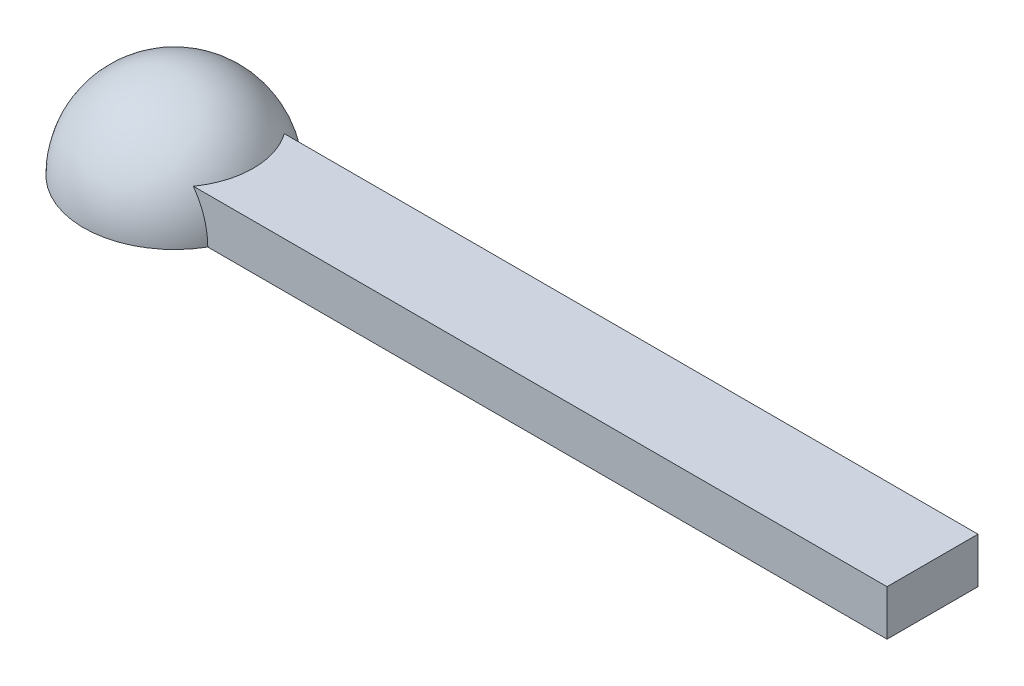
ISO-10303-21;
HEADER;
FILE_DESCRIPTION(('STEP AP214'),'2;1');
FILE_NAME('part.step','',(''),(''),'','','');
FILE_SCHEMA(('AUTOMOTIVE_DESIGN { 1 0 10303 214 1 1 1 1 }'));
ENDSEC;
DATA;
#1=APPLICATION_CONTEXT('core data for automotive mechanical design processes');
#2=APPLICATION_PROTOCOL_DEFINITION('international standard','automotive_design',2000,#1);
#3=PRODUCT_CONTEXT('',#1,'mechanical');
#4=PRODUCT('Part','Part','',(#3));
#5=PRODUCT_RELATED_PRODUCT_CATEGORY('part','',(#4));
#6=PRODUCT_DEFINITION_FORMATION('','',#4);
#7=PRODUCT_DEFINITION_CONTEXT('part definition',#1,'design');
#8=PRODUCT_DEFINITION('design','',#6,#7);
#9=PRODUCT_DEFINITION_SHAPE('','',#8);
#10=(LENGTH_UNIT() NAMED_UNIT(*) SI_UNIT(.MILLI.,.METRE.));
#11=(NAMED_UNIT(*) PLANE_ANGLE_UNIT() SI_UNIT($,.RADIAN.));
#12=(NAMED_UNIT(*) SI_UNIT($,.STERADIAN.) SOLID_ANGLE_UNIT());
#13=UNCERTAINTY_MEASURE_WITH_UNIT(LENGTH_MEASURE(1.E-05),#10,'distance_accuracy_value','');
#14=(GEOMETRIC_REPRESENTATION_CONTEXT(3) GLOBAL_UNCERTAINTY_ASSIGNED_CONTEXT((#13)) GLOBAL_UNIT_ASSIGNED_CONTEXT((#10,
#11,#12)) REPRESENTATION_CONTEXT('',''));
#15=CARTESIAN_POINT('',(0.,0.,0.));
#16=DIRECTION('',(0.,0.,1.));
#17=DIRECTION('',(1.,0.,0.));
#18=AXIS2_PLACEMENT_3D('',#15,#16,#17);
#19=CARTESIAN_POINT('',(0.,0.,0.));
#20=DIRECTION('',(-1.,0.,0.));
#21=DIRECTION('',(0.,0.,1.));
#22=AXIS2_PLACEMENT_3D('',#19,#20,#21);
#23=SPHERICAL_SURFACE('',#22,6.);
#24=CARTESIAN_POINT('',(0.,0.,3.));
#25=DIRECTION('',(0.,0.,1.));
#26=DIRECTION('',(1.,0.,0.));
#27=AXIS2_PLACEMENT_3D('',#24,#25,#26);
#28=CIRCLE('',#27,5.19615242270663);
#29=CARTESIAN_POINT('',(4.24264068711929,3.,3.));
#30=VERTEX_POINT('',#29);
#31=CARTESIAN_POINT('',(5.19615242270663,0.,3.));
#32=VERTEX_POINT('',#31);
#33=EDGE_CURVE('E55',#30,#32,#28,.F.);
#34=ORIENTED_EDGE('',*,*,#33,.F.);
#35=CARTESIAN_POINT('',(0.,3.,0.));
#36=DIRECTION('',(0.,1.,0.));
#37=DIRECTION('',(0.,0.,1.));
#38=AXIS2_PLACEMENT_3D('',#35,#36,#37);
#39=CIRCLE('',#38,5.19615242270663);
#40=CARTESIAN_POINT('',(4.24264068711929,3.,-3.));
#41=VERTEX_POINT('',#40);
#42=EDGE_CURVE('E87',#41,#30,#39,.F.);
#43=ORIENTED_EDGE('',*,*,#42,.F.);
#44=CARTESIAN_POINT('',(0.,0.,-3.));
#45=DIRECTION('',(0.,0.,-1.));
#46=DIRECTION('',(0.,1.,0.));
#47=AXIS2_PLACEMENT_3D('',#44,#45,#46);
#48=CIRCLE('',#47,5.19615242270663);
#49=CARTESIAN_POINT('',(5.19615242270663,0.,-3.));
#50=VERTEX_POINT('',#49);
#51=EDGE_CURVE('E95',#50,#41,#48,.F.);
#52=ORIENTED_EDGE('',*,*,#51,.F.);
#53=CARTESIAN_POINT('',(0.,0.,0.));
#54=DIRECTION('',(0.,-1.,0.));
#55=DIRECTION('',(0.,0.,-1.));
#56=AXIS2_PLACEMENT_3D('',#53,#54,#55);
#57=CIRCLE('',#56,6.);
#58=EDGE_CURVE('E48',#32,#50,#57,.T.);
#59=ORIENTED_EDGE('',*,*,#58,.F.);
#60=EDGE_LOOP('',(#34,#43,#52,#59));
#61=FACE_BOUND('',#60,.T.);
#62=ADVANCED_FACE('F39',(#61),#23,.T.);
#63=CARTESIAN_POINT('',(0.,0.,0.));
#64=DIRECTION('',(-1.,0.,0.));
#65=DIRECTION('',(0.,0.,-1.));
#66=AXIS2_PLACEMENT_3D('',#63,#64,#65);
#67=SPHERICAL_SURFACE('',#66,5.);
#68=CARTESIAN_POINT('',(0.,0.,0.));
#69=DIRECTION('',(0.,1.,0.));
#70=DIRECTION('',(0.,0.,-1.));
#71=AXIS2_PLACEMENT_3D('',#68,#69,#70);
#72=SPHERICAL_SURFACE('',#71,5.);
#73=CARTESIAN_POINT('',(0.,0.,0.));
#74=DIRECTION('',(0.,1.,0.));
#75=DIRECTION('',(0.,0.,-1.));
#76=AXIS2_PLACEMENT_3D('',#73,#74,#75);
#77=CIRCLE('',#76,5.);
#78=CARTESIAN_POINT('',(0.,0.,-5.));
#79=VERTEX_POINT('',#78);
#80=EDGE_CURVE('E11',#79,#79,#77,.T.);
#81=ORIENTED_EDGE('',*,*,#80,.F.);
#82=EDGE_LOOP('',(#81));
#83=FACE_BOUND('',#82,.T.);
#84=ADVANCED_FACE('F41',(#83),#72,.F.);
#85=CARTESIAN_POINT('',(0.,0.,0.));
#86=DIRECTION('',(0.,-1.,0.));
#87=DIRECTION('',(0.,0.,-1.));
#88=AXIS2_PLACEMENT_3D('',#85,#86,#87);
#89=PLANE('',#88);
#90=ORIENTED_EDGE('',*,*,#80,.T.);
#91=EDGE_LOOP('',(#90));
#92=FACE_BOUND('',#91,.T.);
#93=ORIENTED_EDGE('',*,*,#58,.T.);
#94=DIRECTION('',(-1.,0.,0.));
#95=VECTOR('',#94,1.);
#96=CARTESIAN_POINT('',(50.,0.,-3.));
#97=LINE('',#96,#95);
#98=CARTESIAN_POINT('',(50.,0.,-3.));
#99=VERTEX_POINT('',#98);
#100=EDGE_CURVE('E91',#99,#50,#97,.T.);
#101=ORIENTED_EDGE('',*,*,#100,.F.);
#102=DIRECTION('',(0.,0.,-1.));
#103=VECTOR('',#102,1.);
#104=CARTESIAN_POINT('',(50.,0.,3.));
#105=LINE('',#104,#103);
#106=CARTESIAN_POINT('',(50.,0.,3.));
#107=VERTEX_POINT('',#106);
#108=EDGE_CURVE('E111',#107,#99,#105,.T.);
#109=ORIENTED_EDGE('',*,*,#108,.F.);
#110=DIRECTION('',(-1.,0.,0.));
#111=VECTOR('',#110,1.);
#112=CARTESIAN_POINT('',(50.,0.,3.));
#113=LINE('',#112,#111);
#114=EDGE_CURVE('E123',#107,#32,#113,.T.);
#115=ORIENTED_EDGE('',*,*,#114,.T.);
#116=EDGE_LOOP('',(#93,#101,#109,#115));
#117=FACE_BOUND('',#116,.T.);
#118=ADVANCED_FACE('F127',(#92,#117),#89,.T.);
#119=CARTESIAN_POINT('',(50.,3.,3.));
#120=DIRECTION('',(0.,0.,-1.));
#121=DIRECTION('',(-1.,0.,0.));
#122=AXIS2_PLACEMENT_3D('',#119,#120,#121);
#123=PLANE('',#122);
#124=DIRECTION('',(-1.,0.,0.));
#125=VECTOR('',#124,1.);
#126=CARTESIAN_POINT('',(50.,3.,3.));
#127=LINE('',#126,#125);
#128=CARTESIAN_POINT('',(50.,3.,3.));
#129=VERTEX_POINT('',#128);
#130=EDGE_CURVE('E92',#129,#30,#127,.T.);
#131=ORIENTED_EDGE('',*,*,#130,.T.);
#132=ORIENTED_EDGE('',*,*,#33,.T.);
#133=ORIENTED_EDGE('',*,*,#114,.F.);
#134=DIRECTION('',(0.,-1.,0.));
#135=VECTOR('',#134,1.);
#136=CARTESIAN_POINT('',(50.,3.,3.));
#137=LINE('',#136,#135);
#138=EDGE_CURVE('E106',#129,#107,#137,.T.);
#139=ORIENTED_EDGE('',*,*,#138,.F.);
#140=EDGE_LOOP('',(#131,#132,#133,#139));
#141=FACE_BOUND('',#140,.T.);
#142=ADVANCED_FACE('F129',(#141),#123,.F.);
#143=CARTESIAN_POINT('',(50.,3.,-3.));
#144=DIRECTION('',(0.,0.,1.));
#145=DIRECTION('',(0.,-1.,0.));
#146=AXIS2_PLACEMENT_3D('',#143,#144,#145);
#147=PLANE('',#146);
#148=ORIENTED_EDGE('',*,*,#100,.T.);
#149=ORIENTED_EDGE('',*,*,#51,.T.);
#150=DIRECTION('',(-1.,0.,0.));
#151=VECTOR('',#150,1.);
#152=CARTESIAN_POINT('',(50.,3.,-3.));
#153=LINE('',#152,#151);
#154=CARTESIAN_POINT('',(50.,3.,-3.));
#155=VERTEX_POINT('',#154);
#156=EDGE_CURVE('E83',#155,#41,#153,.T.);
#157=ORIENTED_EDGE('',*,*,#156,.F.);
#158=DIRECTION('',(0.,1.,0.));
#159=VECTOR('',#158,1.);
#160=CARTESIAN_POINT('',(50.,3.,-3.));
#161=LINE('',#160,#159);
#162=EDGE_CURVE('E114',#99,#155,#161,.T.);
#163=ORIENTED_EDGE('',*,*,#162,.F.);
#164=EDGE_LOOP('',(#148,#149,#157,#163));
#165=FACE_BOUND('',#164,.T.);
#166=ADVANCED_FACE('F96',(#165),#147,.F.);
#167=CARTESIAN_POINT('',(50.,3.,3.));
#168=DIRECTION('',(0.,-1.,0.));
#169=DIRECTION('',(0.,0.,-1.));
#170=AXIS2_PLACEMENT_3D('',#167,#168,#169);
#171=PLANE('',#170);
#172=ORIENTED_EDGE('',*,*,#156,.T.);
#173=ORIENTED_EDGE('',*,*,#42,.T.);
#174=ORIENTED_EDGE('',*,*,#130,.F.);
#175=DIRECTION('',(0.,0.,1.));
#176=VECTOR('',#175,1.);
#177=CARTESIAN_POINT('',(50.,3.,3.));
#178=LINE('',#177,#176);
#179=EDGE_CURVE('E63',#155,#129,#178,.T.);
#180=ORIENTED_EDGE('',*,*,#179,.F.);
#181=EDGE_LOOP('',(#172,#173,#174,#180));
#182=FACE_BOUND('',#181,.T.);
#183=ADVANCED_FACE('F85',(#182),#171,.F.);
#184=CARTESIAN_POINT('',(50.,0.,0.));
#185=DIRECTION('',(1.,0.,0.));
#186=DIRECTION('',(0.,0.,-1.));
#187=AXIS2_PLACEMENT_3D('',#184,#185,#186);
#188=PLANE('',#187);
#189=ORIENTED_EDGE('',*,*,#138,.T.);
#190=ORIENTED_EDGE('',*,*,#108,.T.);
#191=ORIENTED_EDGE('',*,*,#162,.T.);
#192=ORIENTED_EDGE('',*,*,#179,.T.);
#193=EDGE_LOOP('',(#189,#190,#191,#192));
#194=FACE_BOUND('',#193,.T.);
#195=ADVANCED_FACE('F130',(#194),#188,.T.);
#196=CLOSED_SHELL('',(#62,#84,#118,#142,#166,#183,#195));
#197=MANIFOLD_SOLID_BREP('B2',#196);
#198=ADVANCED_BREP_SHAPE_REPRESENTATION('',(#18,#197),#14);
#199=SHAPE_DEFINITION_REPRESENTATION(#9,#198);
ENDSEC;
END-ISO-10303-21;
